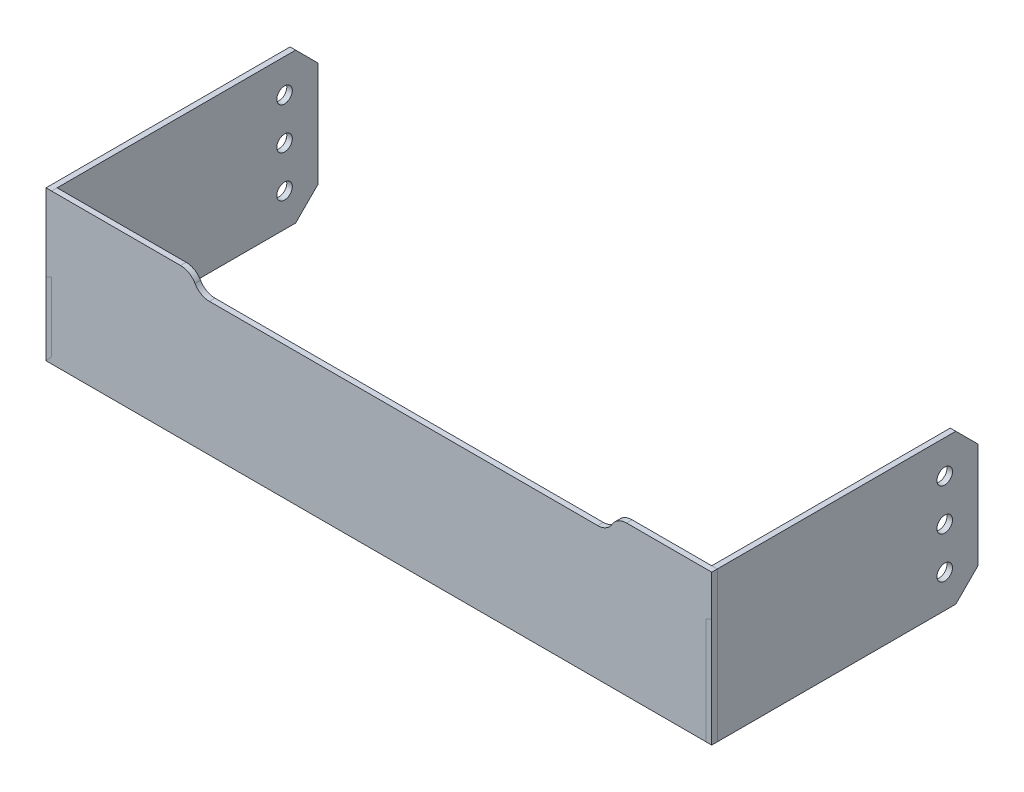
ISO-10303-21;
HEADER;
FILE_DESCRIPTION(('STEP AP214'),'2;1');
FILE_NAME('part.step','',(''),(''),'','','');
FILE_SCHEMA(('AUTOMOTIVE_DESIGN { 1 0 10303 214 1 1 1 1 }'));
ENDSEC;
DATA;
#1=APPLICATION_CONTEXT('core data for automotive mechanical design processes');
#2=APPLICATION_PROTOCOL_DEFINITION('international standard','automotive_design',2000,#1);
#3=PRODUCT_CONTEXT('',#1,'mechanical');
#4=PRODUCT('Part','Part','',(#3));
#5=PRODUCT_RELATED_PRODUCT_CATEGORY('part','',(#4));
#6=PRODUCT_DEFINITION_FORMATION('','',#4);
#7=PRODUCT_DEFINITION_CONTEXT('part definition',#1,'design');
#8=PRODUCT_DEFINITION('design','',#6,#7);
#9=PRODUCT_DEFINITION_SHAPE('','',#8);
#10=(LENGTH_UNIT() NAMED_UNIT(*) SI_UNIT(.MILLI.,.METRE.));
#11=(NAMED_UNIT(*) PLANE_ANGLE_UNIT() SI_UNIT($,.RADIAN.));
#12=(NAMED_UNIT(*) SI_UNIT($,.STERADIAN.) SOLID_ANGLE_UNIT());
#13=UNCERTAINTY_MEASURE_WITH_UNIT(LENGTH_MEASURE(1.E-05),#10,'distance_accuracy_value','');
#14=(GEOMETRIC_REPRESENTATION_CONTEXT(3) GLOBAL_UNCERTAINTY_ASSIGNED_CONTEXT((#13)) GLOBAL_UNIT_ASSIGNED_CONTEXT((#10,
#11,#12)) REPRESENTATION_CONTEXT('',''));
#15=CARTESIAN_POINT('',(0.,0.,0.));
#16=DIRECTION('',(0.,0.,1.));
#17=DIRECTION('',(1.,0.,0.));
#18=AXIS2_PLACEMENT_3D('',#15,#16,#17);
#19=CARTESIAN_POINT('',(-52.2463186573186,21.5222448416486,1.));
#20=DIRECTION('',(0.,0.,1.));
#21=DIRECTION('',(1.,0.,0.));
#22=AXIS2_PLACEMENT_3D('',#19,#20,#21);
#23=PLANE('',#22);
#24=DIRECTION('',(0.,1.,0.));
#25=VECTOR('',#24,1.);
#26=CARTESIAN_POINT('',(-53.2463186573186,21.5222448416486,1.));
#27=LINE('',#26,#25);
#28=CARTESIAN_POINT('',(-53.2463186573186,-5.47775515835141,1.));
#29=VERTEX_POINT('',#28);
#30=CARTESIAN_POINT('',(-53.2463186573186,21.5222448416486,1.));
#31=VERTEX_POINT('',#30);
#32=EDGE_CURVE('E141',#29,#31,#27,.T.);
#33=ORIENTED_EDGE('',*,*,#32,.F.);
#34=DIRECTION('',(-1.,0.,0.));
#35=VECTOR('',#34,1.);
#36=CARTESIAN_POINT('',(-52.2463186573186,-5.47775515835141,1.));
#37=LINE('',#36,#35);
#38=CARTESIAN_POINT('',(-52.2463186573186,-5.47775515835141,1.));
#39=VERTEX_POINT('',#38);
#40=EDGE_CURVE('E120',#39,#29,#37,.T.);
#41=ORIENTED_EDGE('',*,*,#40,.F.);
#42=DIRECTION('',(0.,1.,0.));
#43=VECTOR('',#42,1.);
#44=CARTESIAN_POINT('',(-52.2463186573186,21.5222448416486,1.));
#45=LINE('',#44,#43);
#46=CARTESIAN_POINT('',(-52.2463186573186,21.5222448416486,1.));
#47=VERTEX_POINT('',#46);
#48=EDGE_CURVE('E125',#39,#47,#45,.T.);
#49=ORIENTED_EDGE('',*,*,#48,.T.);
#50=DIRECTION('',(-1.,0.,0.));
#51=VECTOR('',#50,1.);
#52=CARTESIAN_POINT('',(-52.2463186573186,21.5222448416486,1.));
#53=LINE('',#52,#51);
#54=EDGE_CURVE('E110',#47,#31,#53,.T.);
#55=ORIENTED_EDGE('',*,*,#54,.T.);
#56=EDGE_LOOP('',(#33,#41,#49,#55));
#57=FACE_BOUND('',#56,.T.);
#58=ADVANCED_FACE('F54',(#57),#23,.T.);
#59=CARTESIAN_POINT('',(-52.2463186573186,-5.47775515835141,1.));
#60=DIRECTION('',(0.,-1.,0.));
#61=DIRECTION('',(0.,0.,-1.));
#62=AXIS2_PLACEMENT_3D('',#59,#60,#61);
#63=PLANE('',#62);
#64=DIRECTION('',(0.,0.,1.));
#65=VECTOR('',#64,1.);
#66=CARTESIAN_POINT('',(-53.2463186573186,-5.47775515835141,1.));
#67=LINE('',#66,#65);
#68=CARTESIAN_POINT('',(-53.2463186573186,-5.47775515835141,-43.));
#69=VERTEX_POINT('',#68);
#70=EDGE_CURVE('E130',#69,#29,#67,.T.);
#71=ORIENTED_EDGE('',*,*,#70,.F.);
#72=DIRECTION('',(1.,0.,0.));
#73=VECTOR('',#72,1.);
#74=CARTESIAN_POINT('',(-52.2463186573186,-5.47775515835141,-43.));
#75=LINE('',#74,#73);
#76=CARTESIAN_POINT('',(-52.2463186573186,-5.47775515835141,-43.));
#77=VERTEX_POINT('',#76);
#78=EDGE_CURVE('E78',#69,#77,#75,.T.);
#79=ORIENTED_EDGE('',*,*,#78,.T.);
#80=DIRECTION('',(0.,0.,1.));
#81=VECTOR('',#80,1.);
#82=CARTESIAN_POINT('',(-52.2463186573186,-5.47775515835141,1.));
#83=LINE('',#82,#81);
#84=EDGE_CURVE('E121',#77,#39,#83,.T.);
#85=ORIENTED_EDGE('',*,*,#84,.T.);
#86=ORIENTED_EDGE('',*,*,#40,.T.);
#87=EDGE_LOOP('',(#71,#79,#85,#86));
#88=FACE_BOUND('',#87,.T.);
#89=ADVANCED_FACE('F167',(#88),#63,.T.);
#90=CARTESIAN_POINT('',(-52.2463186573186,21.5222448416486,-47.));
#91=DIRECTION('',(0.,0.,-1.));
#92=DIRECTION('',(-1.,0.,0.));
#93=AXIS2_PLACEMENT_3D('',#90,#91,#92);
#94=PLANE('',#93);
#95=DIRECTION('',(0.,-1.,0.));
#96=VECTOR('',#95,1.);
#97=CARTESIAN_POINT('',(-52.2463186573186,21.5222448416486,-47.));
#98=LINE('',#97,#96);
#99=CARTESIAN_POINT('',(-52.2463186573186,17.5222448416486,-47.));
#100=VERTEX_POINT('',#99);
#101=CARTESIAN_POINT('',(-52.2463186573186,-1.4777551583514,-47.));
#102=VERTEX_POINT('',#101);
#103=EDGE_CURVE('E126',#100,#102,#98,.T.);
#104=ORIENTED_EDGE('',*,*,#103,.T.);
#105=DIRECTION('',(-1.,0.,0.));
#106=VECTOR('',#105,1.);
#107=CARTESIAN_POINT('',(-52.2463186573186,-1.4777551583514,-47.));
#108=LINE('',#107,#106);
#109=CARTESIAN_POINT('',(-53.2463186573186,-1.4777551583514,-47.));
#110=VERTEX_POINT('',#109);
#111=EDGE_CURVE('E149',#102,#110,#108,.T.);
#112=ORIENTED_EDGE('',*,*,#111,.T.);
#113=DIRECTION('',(0.,-1.,0.));
#114=VECTOR('',#113,1.);
#115=CARTESIAN_POINT('',(-53.2463186573186,21.5222448416486,-47.));
#116=LINE('',#115,#114);
#117=CARTESIAN_POINT('',(-53.2463186573186,17.5222448416486,-47.));
#118=VERTEX_POINT('',#117);
#119=EDGE_CURVE('E132',#118,#110,#116,.T.);
#120=ORIENTED_EDGE('',*,*,#119,.F.);
#121=DIRECTION('',(1.,0.,0.));
#122=VECTOR('',#121,1.);
#123=CARTESIAN_POINT('',(-52.2463186573186,17.5222448416486,-47.));
#124=LINE('',#123,#122);
#125=EDGE_CURVE('E146',#118,#100,#124,.T.);
#126=ORIENTED_EDGE('',*,*,#125,.T.);
#127=EDGE_LOOP('',(#104,#112,#120,#126));
#128=FACE_BOUND('',#127,.T.);
#129=ADVANCED_FACE('F161',(#128),#94,.T.);
#130=CARTESIAN_POINT('',(-52.2463186573186,21.5222448416486,1.));
#131=DIRECTION('',(0.,1.,0.));
#132=DIRECTION('',(0.,0.,1.));
#133=AXIS2_PLACEMENT_3D('',#130,#131,#132);
#134=PLANE('',#133);
#135=DIRECTION('',(0.,0.,-1.));
#136=VECTOR('',#135,1.);
#137=CARTESIAN_POINT('',(-52.2463186573186,21.5222448416486,1.));
#138=LINE('',#137,#136);
#139=CARTESIAN_POINT('',(-52.2463186573186,21.5222448416486,-43.));
#140=VERTEX_POINT('',#139);
#141=EDGE_CURVE('E112',#47,#140,#138,.T.);
#142=ORIENTED_EDGE('',*,*,#141,.T.);
#143=DIRECTION('',(-1.,0.,0.));
#144=VECTOR('',#143,1.);
#145=CARTESIAN_POINT('',(-52.2463186573186,21.5222448416486,-43.));
#146=LINE('',#145,#144);
#147=CARTESIAN_POINT('',(-53.2463186573186,21.5222448416486,-43.));
#148=VERTEX_POINT('',#147);
#149=EDGE_CURVE('E12',#140,#148,#146,.T.);
#150=ORIENTED_EDGE('',*,*,#149,.T.);
#151=DIRECTION('',(0.,0.,-1.));
#152=VECTOR('',#151,1.);
#153=CARTESIAN_POINT('',(-53.2463186573186,21.5222448416486,1.));
#154=LINE('',#153,#152);
#155=EDGE_CURVE('E115',#31,#148,#154,.T.);
#156=ORIENTED_EDGE('',*,*,#155,.F.);
#157=ORIENTED_EDGE('',*,*,#54,.F.);
#158=EDGE_LOOP('',(#142,#150,#156,#157));
#159=FACE_BOUND('',#158,.T.);
#160=ADVANCED_FACE('F111',(#159),#134,.T.);
#161=CARTESIAN_POINT('',(-52.2463186573186,0.,0.));
#162=DIRECTION('',(1.,0.,0.));
#163=DIRECTION('',(0.,0.,-1.));
#164=AXIS2_PLACEMENT_3D('',#161,#162,#163);
#165=PLANE('',#164);
#166=CARTESIAN_POINT('',(-52.2463186573186,15.5222448416486,-41.));
#167=DIRECTION('',(1.,0.,0.));
#168=DIRECTION('',(0.,0.,-1.));
#169=AXIS2_PLACEMENT_3D('',#166,#167,#168);
#170=CIRCLE('',#169,1.4);
#171=CARTESIAN_POINT('',(-52.2463186573186,15.5222448416486,-42.4));
#172=VERTEX_POINT('',#171);
#173=EDGE_CURVE('E135',#172,#172,#170,.T.);
#174=ORIENTED_EDGE('',*,*,#173,.F.);
#175=EDGE_LOOP('',(#174));
#176=FACE_BOUND('',#175,.T.);
#177=CARTESIAN_POINT('',(-52.2463186573186,8.02224484164859,-41.));
#178=DIRECTION('',(1.,0.,0.));
#179=DIRECTION('',(0.,0.,-1.));
#180=AXIS2_PLACEMENT_3D('',#177,#178,#179);
#181=CIRCLE('',#180,1.4);
#182=CARTESIAN_POINT('',(-52.2463186573186,8.02224484164859,-42.4));
#183=VERTEX_POINT('',#182);
#184=EDGE_CURVE('E218',#183,#183,#181,.T.);
#185=ORIENTED_EDGE('',*,*,#184,.F.);
#186=EDGE_LOOP('',(#185));
#187=FACE_BOUND('',#186,.T.);
#188=CARTESIAN_POINT('',(-52.2463186573186,0.522244841648586,-41.));
#189=DIRECTION('',(1.,0.,0.));
#190=DIRECTION('',(0.,0.,-1.));
#191=AXIS2_PLACEMENT_3D('',#188,#189,#190);
#192=CIRCLE('',#191,1.4);
#193=CARTESIAN_POINT('',(-52.2463186573186,0.522244841648586,-42.4));
#194=VERTEX_POINT('',#193);
#195=EDGE_CURVE('E214',#194,#194,#192,.T.);
#196=ORIENTED_EDGE('',*,*,#195,.F.);
#197=EDGE_LOOP('',(#196));
#198=FACE_BOUND('',#197,.T.);
#199=ORIENTED_EDGE('',*,*,#84,.F.);
#200=DIRECTION('',(0.,-0.707106781186546,0.707106781186549));
#201=VECTOR('',#200,1.);
#202=CARTESIAN_POINT('',(-52.2463186573186,-24.2388775791757,-24.2388775791756));
#203=LINE('',#202,#201);
#204=EDGE_CURVE('E63',#77,#102,#203,.F.);
#205=ORIENTED_EDGE('',*,*,#204,.T.);
#206=ORIENTED_EDGE('',*,*,#103,.F.);
#207=DIRECTION('',(0.,-0.707106781186548,-0.707106781186547));
#208=VECTOR('',#207,1.);
#209=CARTESIAN_POINT('',(-52.2463186573186,32.2611224208243,-32.2611224208243));
#210=LINE('',#209,#208);
#211=EDGE_CURVE('E70',#100,#140,#210,.F.);
#212=ORIENTED_EDGE('',*,*,#211,.T.);
#213=ORIENTED_EDGE('',*,*,#141,.F.);
#214=ORIENTED_EDGE('',*,*,#48,.F.);
#215=EDGE_LOOP('',(#199,#205,#206,#212,#213,#214));
#216=FACE_BOUND('',#215,.T.);
#217=ADVANCED_FACE('F124',(#176,#187,#198,#216),#165,.T.);
#218=CARTESIAN_POINT('',(-53.2463186573186,0.,0.));
#219=DIRECTION('',(1.,0.,0.));
#220=DIRECTION('',(0.,0.,-1.));
#221=AXIS2_PLACEMENT_3D('',#218,#219,#220);
#222=PLANE('',#221);
#223=CARTESIAN_POINT('',(-53.2463186573186,15.5222448416486,-41.));
#224=DIRECTION('',(-1.,0.,0.));
#225=DIRECTION('',(0.,0.,1.));
#226=AXIS2_PLACEMENT_3D('',#223,#224,#225);
#227=CIRCLE('',#226,1.4);
#228=CARTESIAN_POINT('',(-53.2463186573186,15.5222448416486,-39.6));
#229=VERTEX_POINT('',#228);
#230=EDGE_CURVE('E213',#229,#229,#227,.T.);
#231=ORIENTED_EDGE('',*,*,#230,.F.);
#232=EDGE_LOOP('',(#231));
#233=FACE_BOUND('',#232,.T.);
#234=CARTESIAN_POINT('',(-53.2463186573186,8.02224484164859,-41.));
#235=DIRECTION('',(-1.,0.,0.));
#236=DIRECTION('',(0.,0.,1.));
#237=AXIS2_PLACEMENT_3D('',#234,#235,#236);
#238=CIRCLE('',#237,1.4);
#239=CARTESIAN_POINT('',(-53.2463186573186,8.02224484164859,-39.6));
#240=VERTEX_POINT('',#239);
#241=EDGE_CURVE('E215',#240,#240,#238,.T.);
#242=ORIENTED_EDGE('',*,*,#241,.F.);
#243=EDGE_LOOP('',(#242));
#244=FACE_BOUND('',#243,.T.);
#245=CARTESIAN_POINT('',(-53.2463186573186,0.522244841648586,-41.));
#246=DIRECTION('',(-1.,0.,0.));
#247=DIRECTION('',(0.,0.,1.));
#248=AXIS2_PLACEMENT_3D('',#245,#246,#247);
#249=CIRCLE('',#248,1.4);
#250=CARTESIAN_POINT('',(-53.2463186573186,0.522244841648586,-39.6));
#251=VERTEX_POINT('',#250);
#252=EDGE_CURVE('E221',#251,#251,#249,.T.);
#253=ORIENTED_EDGE('',*,*,#252,.F.);
#254=EDGE_LOOP('',(#253));
#255=FACE_BOUND('',#254,.T.);
#256=ORIENTED_EDGE('',*,*,#119,.T.);
#257=DIRECTION('',(0.,0.707106781186546,-0.707106781186549));
#258=VECTOR('',#257,1.);
#259=CARTESIAN_POINT('',(-53.2463186573186,-1.4777551583514,-47.));
#260=LINE('',#259,#258);
#261=EDGE_CURVE('E154',#110,#69,#260,.F.);
#262=ORIENTED_EDGE('',*,*,#261,.T.);
#263=ORIENTED_EDGE('',*,*,#70,.T.);
#264=ORIENTED_EDGE('',*,*,#32,.T.);
#265=ORIENTED_EDGE('',*,*,#155,.T.);
#266=DIRECTION('',(0.,0.707106781186548,0.707106781186547));
#267=VECTOR('',#266,1.);
#268=CARTESIAN_POINT('',(-53.2463186573186,21.5222448416486,-43.));
#269=LINE('',#268,#267);
#270=EDGE_CURVE('E152',#148,#118,#269,.F.);
#271=ORIENTED_EDGE('',*,*,#270,.T.);
#272=EDGE_LOOP('',(#256,#262,#263,#264,#265,#271));
#273=FACE_BOUND('',#272,.T.);
#274=ADVANCED_FACE('F166',(#233,#244,#255,#273),#222,.F.);
#275=CARTESIAN_POINT('',(-52.2463186573186,-1.4777551583514,-47.));
#276=DIRECTION('',(0.,0.707106781186549,0.707106781186546));
#277=DIRECTION('',(-1.,0.,0.));
#278=AXIS2_PLACEMENT_3D('',#275,#276,#277);
#279=PLANE('',#278);
#280=ORIENTED_EDGE('',*,*,#204,.F.);
#281=ORIENTED_EDGE('',*,*,#78,.F.);
#282=ORIENTED_EDGE('',*,*,#261,.F.);
#283=ORIENTED_EDGE('',*,*,#111,.F.);
#284=EDGE_LOOP('',(#280,#281,#282,#283));
#285=FACE_BOUND('',#284,.T.);
#286=ADVANCED_FACE('F164',(#285),#279,.F.);
#287=CARTESIAN_POINT('',(-52.2463186573186,21.5222448416486,-43.));
#288=DIRECTION('',(0.,-0.707106781186547,0.707106781186548));
#289=DIRECTION('',(-1.,0.,0.));
#290=AXIS2_PLACEMENT_3D('',#287,#288,#289);
#291=PLANE('',#290);
#292=ORIENTED_EDGE('',*,*,#211,.F.);
#293=ORIENTED_EDGE('',*,*,#125,.F.);
#294=ORIENTED_EDGE('',*,*,#270,.F.);
#295=ORIENTED_EDGE('',*,*,#149,.F.);
#296=EDGE_LOOP('',(#292,#293,#294,#295));
#297=FACE_BOUND('',#296,.T.);
#298=ADVANCED_FACE('F57',(#297),#291,.F.);
#299=CARTESIAN_POINT('',(66.7536813426814,0.522244841648586,-41.));
#300=DIRECTION('',(-1.,0.,0.));
#301=DIRECTION('',(0.,0.,1.));
#302=AXIS2_PLACEMENT_3D('',#299,#300,#301);
#303=CYLINDRICAL_SURFACE('',#302,1.4);
#304=ORIENTED_EDGE('',*,*,#195,.T.);
#305=EDGE_LOOP('',(#304));
#306=FACE_BOUND('',#305,.T.);
#307=ORIENTED_EDGE('',*,*,#252,.T.);
#308=EDGE_LOOP('',(#307));
#309=FACE_BOUND('',#308,.T.);
#310=ADVANCED_FACE('F170',(#306,#309),#303,.F.);
#311=CARTESIAN_POINT('',(66.7536813426814,8.02224484164859,-41.));
#312=DIRECTION('',(-1.,0.,0.));
#313=DIRECTION('',(0.,0.,1.));
#314=AXIS2_PLACEMENT_3D('',#311,#312,#313);
#315=CYLINDRICAL_SURFACE('',#314,1.4);
#316=ORIENTED_EDGE('',*,*,#184,.T.);
#317=EDGE_LOOP('',(#316));
#318=FACE_BOUND('',#317,.T.);
#319=ORIENTED_EDGE('',*,*,#241,.T.);
#320=EDGE_LOOP('',(#319));
#321=FACE_BOUND('',#320,.T.);
#322=ADVANCED_FACE('F175',(#318,#321),#315,.F.);
#323=CARTESIAN_POINT('',(66.7536813426814,15.5222448416486,-41.));
#324=DIRECTION('',(-1.,0.,0.));
#325=DIRECTION('',(0.,0.,1.));
#326=AXIS2_PLACEMENT_3D('',#323,#324,#325);
#327=CYLINDRICAL_SURFACE('',#326,1.4);
#328=ORIENTED_EDGE('',*,*,#173,.T.);
#329=EDGE_LOOP('',(#328));
#330=FACE_BOUND('',#329,.T.);
#331=ORIENTED_EDGE('',*,*,#230,.T.);
#332=EDGE_LOOP('',(#331));
#333=FACE_BOUND('',#332,.T.);
#334=ADVANCED_FACE('F202',(#330,#333),#327,.F.);
#335=CLOSED_SHELL('',(#58,#89,#129,#160,#217,#274,#286,#298,#310,#322,#334));
#336=MANIFOLD_SOLID_BREP('B2',#335);
#337=CARTESIAN_POINT('',(65.7536813426814,21.5222448416486,1.));
#338=DIRECTION('',(0.,0.,1.));
#339=DIRECTION('',(0.,-1.,0.));
#340=AXIS2_PLACEMENT_3D('',#337,#338,#339);
#341=PLANE('',#340);
#342=DIRECTION('',(0.,-1.,0.));
#343=VECTOR('',#342,1.);
#344=CARTESIAN_POINT('',(66.7536813426814,21.5222448416486,1.));
#345=LINE('',#344,#343);
#346=CARTESIAN_POINT('',(66.7536813426814,21.5222448416486,1.));
#347=VERTEX_POINT('',#346);
#348=CARTESIAN_POINT('',(66.7536813426814,-5.47775515835141,0.999999999999997));
#349=VERTEX_POINT('',#348);
#350=EDGE_CURVE('E429',#347,#349,#345,.T.);
#351=ORIENTED_EDGE('',*,*,#350,.F.);
#352=DIRECTION('',(1.,0.,0.));
#353=VECTOR('',#352,1.);
#354=CARTESIAN_POINT('',(65.7536813426814,21.5222448416486,1.));
#355=LINE('',#354,#353);
#356=CARTESIAN_POINT('',(65.7536813426814,21.5222448416486,1.));
#357=VERTEX_POINT('',#356);
#358=EDGE_CURVE('E408',#357,#347,#355,.T.);
#359=ORIENTED_EDGE('',*,*,#358,.F.);
#360=DIRECTION('',(0.,-1.,0.));
#361=VECTOR('',#360,1.);
#362=CARTESIAN_POINT('',(65.7536813426814,21.5222448416486,1.));
#363=LINE('',#362,#361);
#364=CARTESIAN_POINT('',(65.7536813426814,-5.47775515835141,0.999999999999997));
#365=VERTEX_POINT('',#364);
#366=EDGE_CURVE('E413',#357,#365,#363,.T.);
#367=ORIENTED_EDGE('',*,*,#366,.T.);
#368=DIRECTION('',(1.,0.,0.));
#369=VECTOR('',#368,1.);
#370=CARTESIAN_POINT('',(65.7536813426814,-5.47775515835141,0.999999999999997));
#371=LINE('',#370,#369);
#372=EDGE_CURVE('E396',#365,#349,#371,.T.);
#373=ORIENTED_EDGE('',*,*,#372,.T.);
#374=EDGE_LOOP('',(#351,#359,#367,#373));
#375=FACE_BOUND('',#374,.T.);
#376=ADVANCED_FACE('F342',(#375),#341,.T.);
#377=CARTESIAN_POINT('',(65.7536813426814,21.5222448416486,1.));
#378=DIRECTION('',(0.,1.,0.));
#379=DIRECTION('',(0.,0.,1.));
#380=AXIS2_PLACEMENT_3D('',#377,#378,#379);
#381=PLANE('',#380);
#382=DIRECTION('',(0.,0.,1.));
#383=VECTOR('',#382,1.);
#384=CARTESIAN_POINT('',(66.7536813426814,21.5222448416486,1.));
#385=LINE('',#384,#383);
#386=CARTESIAN_POINT('',(66.7536813426814,21.5222448416486,-43.));
#387=VERTEX_POINT('',#386);
#388=EDGE_CURVE('E419',#387,#347,#385,.T.);
#389=ORIENTED_EDGE('',*,*,#388,.F.);
#390=DIRECTION('',(-1.,0.,0.));
#391=VECTOR('',#390,1.);
#392=CARTESIAN_POINT('',(65.7536813426814,21.5222448416486,-43.));
#393=LINE('',#392,#391);
#394=CARTESIAN_POINT('',(65.7536813426814,21.5222448416486,-43.));
#395=VERTEX_POINT('',#394);
#396=EDGE_CURVE('E52',#387,#395,#393,.T.);
#397=ORIENTED_EDGE('',*,*,#396,.T.);
#398=DIRECTION('',(0.,0.,1.));
#399=VECTOR('',#398,1.);
#400=CARTESIAN_POINT('',(65.7536813426814,21.5222448416486,1.));
#401=LINE('',#400,#399);
#402=EDGE_CURVE('E409',#395,#357,#401,.T.);
#403=ORIENTED_EDGE('',*,*,#402,.T.);
#404=ORIENTED_EDGE('',*,*,#358,.T.);
#405=EDGE_LOOP('',(#389,#397,#403,#404));
#406=FACE_BOUND('',#405,.T.);
#407=ADVANCED_FACE('F455',(#406),#381,.T.);
#408=CARTESIAN_POINT('',(65.7536813426814,21.5222448416486,-47.));
#409=DIRECTION('',(0.,0.,-1.));
#410=DIRECTION('',(-1.,0.,0.));
#411=AXIS2_PLACEMENT_3D('',#408,#409,#410);
#412=PLANE('',#411);
#413=DIRECTION('',(0.,1.,0.));
#414=VECTOR('',#413,1.);
#415=CARTESIAN_POINT('',(66.7536813426814,21.5222448416486,-47.));
#416=LINE('',#415,#414);
#417=CARTESIAN_POINT('',(66.7536813426814,-1.47775515835139,-47.));
#418=VERTEX_POINT('',#417);
#419=CARTESIAN_POINT('',(66.7536813426814,17.5222448416486,-47.));
#420=VERTEX_POINT('',#419);
#421=EDGE_CURVE('E421',#418,#420,#416,.T.);
#422=ORIENTED_EDGE('',*,*,#421,.F.);
#423=DIRECTION('',(-1.,0.,0.));
#424=VECTOR('',#423,1.);
#425=CARTESIAN_POINT('',(65.7536813426814,-1.47775515835139,-47.));
#426=LINE('',#425,#424);
#427=CARTESIAN_POINT('',(65.7536813426814,-1.47775515835139,-47.));
#428=VERTEX_POINT('',#427);
#429=EDGE_CURVE('E444',#418,#428,#426,.T.);
#430=ORIENTED_EDGE('',*,*,#429,.T.);
#431=DIRECTION('',(0.,1.,0.));
#432=VECTOR('',#431,1.);
#433=CARTESIAN_POINT('',(65.7536813426814,21.5222448416486,-47.));
#434=LINE('',#433,#432);
#435=CARTESIAN_POINT('',(65.7536813426814,17.5222448416486,-47.));
#436=VERTEX_POINT('',#435);
#437=EDGE_CURVE('E415',#428,#436,#434,.T.);
#438=ORIENTED_EDGE('',*,*,#437,.T.);
#439=DIRECTION('',(1.,0.,0.));
#440=VECTOR('',#439,1.);
#441=CARTESIAN_POINT('',(65.7536813426814,17.5222448416486,-47.));
#442=LINE('',#441,#440);
#443=EDGE_CURVE('E441',#436,#420,#442,.T.);
#444=ORIENTED_EDGE('',*,*,#443,.T.);
#445=EDGE_LOOP('',(#422,#430,#438,#444));
#446=FACE_BOUND('',#445,.T.);
#447=ADVANCED_FACE('F449',(#446),#412,.T.);
#448=CARTESIAN_POINT('',(65.7536813426814,-5.47775515835141,0.999999999999997));
#449=DIRECTION('',(0.,-1.,0.));
#450=DIRECTION('',(0.,0.,-1.));
#451=AXIS2_PLACEMENT_3D('',#448,#449,#450);
#452=PLANE('',#451);
#453=DIRECTION('',(0.,0.,-1.));
#454=VECTOR('',#453,1.);
#455=CARTESIAN_POINT('',(65.7536813426814,-5.47775515835141,0.999999999999997));
#456=LINE('',#455,#454);
#457=CARTESIAN_POINT('',(65.7536813426814,-5.47775515835141,-43.));
#458=VERTEX_POINT('',#457);
#459=EDGE_CURVE('E400',#365,#458,#456,.T.);
#460=ORIENTED_EDGE('',*,*,#459,.T.);
#461=DIRECTION('',(1.,0.,0.));
#462=VECTOR('',#461,1.);
#463=CARTESIAN_POINT('',(65.7536813426814,-5.47775515835141,-43.));
#464=LINE('',#463,#462);
#465=CARTESIAN_POINT('',(66.7536813426814,-5.47775515835141,-43.));
#466=VERTEX_POINT('',#465);
#467=EDGE_CURVE('E434',#458,#466,#464,.T.);
#468=ORIENTED_EDGE('',*,*,#467,.T.);
#469=DIRECTION('',(0.,0.,-1.));
#470=VECTOR('',#469,1.);
#471=CARTESIAN_POINT('',(66.7536813426814,-5.47775515835141,0.999999999999997));
#472=LINE('',#471,#470);
#473=EDGE_CURVE('E403',#349,#466,#472,.T.);
#474=ORIENTED_EDGE('',*,*,#473,.F.);
#475=ORIENTED_EDGE('',*,*,#372,.F.);
#476=EDGE_LOOP('',(#460,#468,#474,#475));
#477=FACE_BOUND('',#476,.T.);
#478=ADVANCED_FACE('F398',(#477),#452,.T.);
#479=CARTESIAN_POINT('',(65.7536813426814,0.,0.));
#480=DIRECTION('',(1.,0.,0.));
#481=DIRECTION('',(0.,0.,-1.));
#482=AXIS2_PLACEMENT_3D('',#479,#480,#481);
#483=PLANE('',#482);
#484=CARTESIAN_POINT('',(65.7536813426814,15.5222448416486,-41.));
#485=DIRECTION('',(1.,0.,0.));
#486=DIRECTION('',(0.,0.,-1.));
#487=AXIS2_PLACEMENT_3D('',#484,#485,#486);
#488=CIRCLE('',#487,1.4);
#489=CARTESIAN_POINT('',(65.7536813426814,15.5222448416486,-42.4));
#490=VERTEX_POINT('',#489);
#491=EDGE_CURVE('E424',#490,#490,#488,.T.);
#492=ORIENTED_EDGE('',*,*,#491,.T.);
#493=EDGE_LOOP('',(#492));
#494=FACE_BOUND('',#493,.T.);
#495=CARTESIAN_POINT('',(65.7536813426814,8.02224484164859,-41.));
#496=DIRECTION('',(1.,0.,0.));
#497=DIRECTION('',(0.,0.,-1.));
#498=AXIS2_PLACEMENT_3D('',#495,#496,#497);
#499=CIRCLE('',#498,1.4);
#500=CARTESIAN_POINT('',(65.7536813426814,8.02224484164859,-42.4));
#501=VERTEX_POINT('',#500);
#502=EDGE_CURVE('E502',#501,#501,#499,.T.);
#503=ORIENTED_EDGE('',*,*,#502,.T.);
#504=EDGE_LOOP('',(#503));
#505=FACE_BOUND('',#504,.T.);
#506=CARTESIAN_POINT('',(65.7536813426814,0.522244841648586,-41.));
#507=DIRECTION('',(1.,0.,0.));
#508=DIRECTION('',(0.,0.,-1.));
#509=AXIS2_PLACEMENT_3D('',#506,#507,#508);
#510=CIRCLE('',#509,1.4);
#511=CARTESIAN_POINT('',(65.7536813426814,0.522244841648586,-42.4));
#512=VERTEX_POINT('',#511);
#513=EDGE_CURVE('E504',#512,#512,#510,.T.);
#514=ORIENTED_EDGE('',*,*,#513,.T.);
#515=EDGE_LOOP('',(#514));
#516=FACE_BOUND('',#515,.T.);
#517=ORIENTED_EDGE('',*,*,#437,.F.);
#518=DIRECTION('',(0.,0.707106781186549,-0.707106781186546));
#519=VECTOR('',#518,1.);
#520=CARTESIAN_POINT('',(65.7536813426814,-5.47775515835141,-43.));
#521=LINE('',#520,#519);
#522=EDGE_CURVE('E351',#428,#458,#521,.F.);
#523=ORIENTED_EDGE('',*,*,#522,.T.);
#524=ORIENTED_EDGE('',*,*,#459,.F.);
#525=ORIENTED_EDGE('',*,*,#366,.F.);
#526=ORIENTED_EDGE('',*,*,#402,.F.);
#527=DIRECTION('',(0.,0.707106781186546,0.707106781186549));
#528=VECTOR('',#527,1.);
#529=CARTESIAN_POINT('',(65.7536813426814,17.5222448416486,-47.));
#530=LINE('',#529,#528);
#531=EDGE_CURVE('E363',#395,#436,#530,.F.);
#532=ORIENTED_EDGE('',*,*,#531,.T.);
#533=EDGE_LOOP('',(#517,#523,#524,#525,#526,#532));
#534=FACE_BOUND('',#533,.T.);
#535=ADVANCED_FACE('F412',(#494,#505,#516,#534),#483,.F.);
#536=CARTESIAN_POINT('',(66.7536813426814,0.,0.));
#537=DIRECTION('',(1.,0.,0.));
#538=DIRECTION('',(0.,0.,-1.));
#539=AXIS2_PLACEMENT_3D('',#536,#537,#538);
#540=PLANE('',#539);
#541=CARTESIAN_POINT('',(66.7536813426814,15.5222448416486,-41.));
#542=DIRECTION('',(-1.,0.,0.));
#543=DIRECTION('',(0.,0.,1.));
#544=AXIS2_PLACEMENT_3D('',#541,#542,#543);
#545=CIRCLE('',#544,1.4);
#546=CARTESIAN_POINT('',(66.7536813426814,15.5222448416486,-39.6));
#547=VERTEX_POINT('',#546);
#548=EDGE_CURVE('E499',#547,#547,#545,.T.);
#549=ORIENTED_EDGE('',*,*,#548,.T.);
#550=EDGE_LOOP('',(#549));
#551=FACE_BOUND('',#550,.T.);
#552=CARTESIAN_POINT('',(66.7536813426814,8.02224484164859,-41.));
#553=DIRECTION('',(-1.,0.,0.));
#554=DIRECTION('',(0.,0.,1.));
#555=AXIS2_PLACEMENT_3D('',#552,#553,#554);
#556=CIRCLE('',#555,1.4);
#557=CARTESIAN_POINT('',(66.7536813426814,8.02224484164859,-39.6));
#558=VERTEX_POINT('',#557);
#559=EDGE_CURVE('E513',#558,#558,#556,.T.);
#560=ORIENTED_EDGE('',*,*,#559,.T.);
#561=EDGE_LOOP('',(#560));
#562=FACE_BOUND('',#561,.T.);
#563=CARTESIAN_POINT('',(66.7536813426814,0.522244841648586,-41.));
#564=DIRECTION('',(-1.,0.,0.));
#565=DIRECTION('',(0.,0.,1.));
#566=AXIS2_PLACEMENT_3D('',#563,#564,#565);
#567=CIRCLE('',#566,1.4);
#568=CARTESIAN_POINT('',(66.7536813426814,0.522244841648586,-39.6));
#569=VERTEX_POINT('',#568);
#570=EDGE_CURVE('E510',#569,#569,#567,.T.);
#571=ORIENTED_EDGE('',*,*,#570,.T.);
#572=EDGE_LOOP('',(#571));
#573=FACE_BOUND('',#572,.T.);
#574=ORIENTED_EDGE('',*,*,#473,.T.);
#575=DIRECTION('',(0.,-0.707106781186549,0.707106781186546));
#576=VECTOR('',#575,1.);
#577=CARTESIAN_POINT('',(66.7536813426814,-24.2388775791757,-24.2388775791758));
#578=LINE('',#577,#576);
#579=EDGE_CURVE('E439',#466,#418,#578,.F.);
#580=ORIENTED_EDGE('',*,*,#579,.T.);
#581=ORIENTED_EDGE('',*,*,#421,.T.);
#582=DIRECTION('',(0.,-0.707106781186546,-0.707106781186549));
#583=VECTOR('',#582,1.);
#584=CARTESIAN_POINT('',(66.7536813426814,32.2611224208243,-32.2611224208242));
#585=LINE('',#584,#583);
#586=EDGE_CURVE('E437',#420,#387,#585,.F.);
#587=ORIENTED_EDGE('',*,*,#586,.T.);
#588=ORIENTED_EDGE('',*,*,#388,.T.);
#589=ORIENTED_EDGE('',*,*,#350,.T.);
#590=EDGE_LOOP('',(#574,#580,#581,#587,#588,#589));
#591=FACE_BOUND('',#590,.T.);
#592=ADVANCED_FACE('F454',(#551,#562,#573,#591),#540,.T.);
#593=CARTESIAN_POINT('',(65.7536813426814,-5.47775515835141,-43.));
#594=DIRECTION('',(0.,0.707106781186546,0.707106781186549));
#595=DIRECTION('',(1.,0.,0.));
#596=AXIS2_PLACEMENT_3D('',#593,#594,#595);
#597=PLANE('',#596);
#598=ORIENTED_EDGE('',*,*,#522,.F.);
#599=ORIENTED_EDGE('',*,*,#429,.F.);
#600=ORIENTED_EDGE('',*,*,#579,.F.);
#601=ORIENTED_EDGE('',*,*,#467,.F.);
#602=EDGE_LOOP('',(#598,#599,#600,#601));
#603=FACE_BOUND('',#602,.T.);
#604=ADVANCED_FACE('F452',(#603),#597,.F.);
#605=CARTESIAN_POINT('',(65.7536813426814,17.5222448416486,-47.));
#606=DIRECTION('',(0.,-0.707106781186549,0.707106781186546));
#607=DIRECTION('',(1.,0.,0.));
#608=AXIS2_PLACEMENT_3D('',#605,#606,#607);
#609=PLANE('',#608);
#610=ORIENTED_EDGE('',*,*,#531,.F.);
#611=ORIENTED_EDGE('',*,*,#396,.F.);
#612=ORIENTED_EDGE('',*,*,#586,.F.);
#613=ORIENTED_EDGE('',*,*,#443,.F.);
#614=EDGE_LOOP('',(#610,#611,#612,#613));
#615=FACE_BOUND('',#614,.T.);
#616=ADVANCED_FACE('F345',(#615),#609,.F.);
#617=CARTESIAN_POINT('',(66.7536813426814,0.522244841648586,-41.));
#618=DIRECTION('',(-1.,0.,0.));
#619=DIRECTION('',(0.,0.,1.));
#620=AXIS2_PLACEMENT_3D('',#617,#618,#619);
#621=CYLINDRICAL_SURFACE('',#620,1.4);
#622=ORIENTED_EDGE('',*,*,#570,.F.);
#623=EDGE_LOOP('',(#622));
#624=FACE_BOUND('',#623,.T.);
#625=ORIENTED_EDGE('',*,*,#513,.F.);
#626=EDGE_LOOP('',(#625));
#627=FACE_BOUND('',#626,.T.);
#628=ADVANCED_FACE('F458',(#624,#627),#621,.F.);
#629=CARTESIAN_POINT('',(66.7536813426814,8.02224484164859,-41.));
#630=DIRECTION('',(-1.,0.,0.));
#631=DIRECTION('',(0.,0.,1.));
#632=AXIS2_PLACEMENT_3D('',#629,#630,#631);
#633=CYLINDRICAL_SURFACE('',#632,1.4);
#634=ORIENTED_EDGE('',*,*,#559,.F.);
#635=EDGE_LOOP('',(#634));
#636=FACE_BOUND('',#635,.T.);
#637=ORIENTED_EDGE('',*,*,#502,.F.);
#638=EDGE_LOOP('',(#637));
#639=FACE_BOUND('',#638,.T.);
#640=ADVANCED_FACE('F463',(#636,#639),#633,.F.);
#641=CARTESIAN_POINT('',(66.7536813426814,15.5222448416486,-41.));
#642=DIRECTION('',(-1.,0.,0.));
#643=DIRECTION('',(0.,0.,1.));
#644=AXIS2_PLACEMENT_3D('',#641,#642,#643);
#645=CYLINDRICAL_SURFACE('',#644,1.4);
#646=ORIENTED_EDGE('',*,*,#548,.F.);
#647=EDGE_LOOP('',(#646));
#648=FACE_BOUND('',#647,.T.);
#649=ORIENTED_EDGE('',*,*,#491,.F.);
#650=EDGE_LOOP('',(#649));
#651=FACE_BOUND('',#650,.T.);
#652=ADVANCED_FACE('F490',(#648,#651),#645,.F.);
#653=CLOSED_SHELL('',(#376,#407,#447,#478,#535,#592,#604,#616,#628,#640,#652));
#654=MANIFOLD_SOLID_BREP('B6',#653);
#655=CARTESIAN_POINT('',(-53.2463186573186,-5.47775515835141,1.));
#656=DIRECTION('',(1.,0.,0.));
#657=DIRECTION('',(0.,0.,-1.));
#658=AXIS2_PLACEMENT_3D('',#655,#656,#657);
#659=PLANE('',#658);
#660=DIRECTION('',(0.,-1.,0.));
#661=VECTOR('',#660,1.);
#662=CARTESIAN_POINT('',(-53.2463186573186,-5.47775515835141,0.));
#663=LINE('',#662,#661);
#664=CARTESIAN_POINT('',(-53.2463186573186,21.5222448416486,0.));
#665=VERTEX_POINT('',#664);
#666=CARTESIAN_POINT('',(-53.2463186573186,-5.47775515835141,0.));
#667=VERTEX_POINT('',#666);
#668=EDGE_CURVE('E720',#665,#667,#663,.T.);
#669=ORIENTED_EDGE('',*,*,#668,.T.);
#670=DIRECTION('',(0.,0.,-1.));
#671=VECTOR('',#670,1.);
#672=CARTESIAN_POINT('',(-53.2463186573186,-5.47775515835141,1.));
#673=LINE('',#672,#671);
#674=CARTESIAN_POINT('',(-53.2463186573186,-5.47775515835141,1.));
#675=VERTEX_POINT('',#674);
#676=EDGE_CURVE('E702',#675,#667,#673,.T.);
#677=ORIENTED_EDGE('',*,*,#676,.F.);
#678=DIRECTION('',(0.,-1.,0.));
#679=VECTOR('',#678,1.);
#680=CARTESIAN_POINT('',(-53.2463186573186,-5.47775515835141,1.));
#681=LINE('',#680,#679);
#682=CARTESIAN_POINT('',(-53.2463186573186,21.5222448416486,1.));
#683=VERTEX_POINT('',#682);
#684=EDGE_CURVE('E708',#683,#675,#681,.T.);
#685=ORIENTED_EDGE('',*,*,#684,.F.);
#686=DIRECTION('',(0.,0.,-1.));
#687=VECTOR('',#686,1.);
#688=CARTESIAN_POINT('',(-53.2463186573186,21.5222448416486,1.));
#689=LINE('',#688,#687);
#690=EDGE_CURVE('E766',#683,#665,#689,.T.);
#691=ORIENTED_EDGE('',*,*,#690,.T.);
#692=EDGE_LOOP('',(#669,#677,#685,#691));
#693=FACE_BOUND('',#692,.T.);
#694=ADVANCED_FACE('F621',(#693),#659,.F.);
#695=CARTESIAN_POINT('',(-53.2463186573186,-5.47775515835141,1.));
#696=DIRECTION('',(0.,1.,0.));
#697=DIRECTION('',(0.,0.,1.));
#698=AXIS2_PLACEMENT_3D('',#695,#696,#697);
#699=PLANE('',#698);
#700=DIRECTION('',(1.,0.,0.));
#701=VECTOR('',#700,1.);
#702=CARTESIAN_POINT('',(-53.2463186573186,-5.47775515835141,0.));
#703=LINE('',#702,#701);
#704=CARTESIAN_POINT('',(66.7536813426814,-5.47775515835141,0.));
#705=VERTEX_POINT('',#704);
#706=EDGE_CURVE('E779',#667,#705,#703,.T.);
#707=ORIENTED_EDGE('',*,*,#706,.T.);
#708=DIRECTION('',(0.,0.,-1.));
#709=VECTOR('',#708,1.);
#710=CARTESIAN_POINT('',(66.7536813426814,-5.47775515835141,1.));
#711=LINE('',#710,#709);
#712=CARTESIAN_POINT('',(66.7536813426814,-5.47775515835141,1.));
#713=VERTEX_POINT('',#712);
#714=EDGE_CURVE('E705',#713,#705,#711,.T.);
#715=ORIENTED_EDGE('',*,*,#714,.F.);
#716=DIRECTION('',(1.,0.,0.));
#717=VECTOR('',#716,1.);
#718=CARTESIAN_POINT('',(-53.2463186573186,-5.47775515835141,1.));
#719=LINE('',#718,#717);
#720=EDGE_CURVE('E698',#675,#713,#719,.T.);
#721=ORIENTED_EDGE('',*,*,#720,.F.);
#722=ORIENTED_EDGE('',*,*,#676,.T.);
#723=EDGE_LOOP('',(#707,#715,#721,#722));
#724=FACE_BOUND('',#723,.T.);
#725=ADVANCED_FACE('F700',(#724),#699,.F.);
#726=CARTESIAN_POINT('',(66.7536813426814,-5.47775515835141,1.));
#727=DIRECTION('',(-1.,0.,0.));
#728=DIRECTION('',(0.,0.,1.));
#729=AXIS2_PLACEMENT_3D('',#726,#727,#728);
#730=PLANE('',#729);
#731=DIRECTION('',(0.,1.,0.));
#732=VECTOR('',#731,1.);
#733=CARTESIAN_POINT('',(66.7536813426814,-5.47775515835141,0.));
#734=LINE('',#733,#732);
#735=CARTESIAN_POINT('',(66.7536813426814,21.5222448416486,0.));
#736=VERTEX_POINT('',#735);
#737=EDGE_CURVE('E778',#705,#736,#734,.T.);
#738=ORIENTED_EDGE('',*,*,#737,.T.);
#739=DIRECTION('',(0.,0.,-1.));
#740=VECTOR('',#739,1.);
#741=CARTESIAN_POINT('',(66.7536813426814,21.5222448416486,1.));
#742=LINE('',#741,#740);
#743=CARTESIAN_POINT('',(66.7536813426814,21.5222448416486,1.));
#744=VERTEX_POINT('',#743);
#745=EDGE_CURVE('E726',#744,#736,#742,.T.);
#746=ORIENTED_EDGE('',*,*,#745,.F.);
#747=DIRECTION('',(0.,1.,0.));
#748=VECTOR('',#747,1.);
#749=CARTESIAN_POINT('',(66.7536813426814,-5.47775515835141,1.));
#750=LINE('',#749,#748);
#751=EDGE_CURVE('E707',#713,#744,#750,.T.);
#752=ORIENTED_EDGE('',*,*,#751,.F.);
#753=ORIENTED_EDGE('',*,*,#714,.T.);
#754=EDGE_LOOP('',(#738,#746,#752,#753));
#755=FACE_BOUND('',#754,.T.);
#756=ADVANCED_FACE('F790',(#755),#730,.F.);
#757=CARTESIAN_POINT('',(49.2071183643734,21.5222448416486,1.));
#758=DIRECTION('',(0.,-1.,0.));
#759=DIRECTION('',(1.,0.,0.));
#760=AXIS2_PLACEMENT_3D('',#757,#758,#759);
#761=PLANE('',#760);
#762=DIRECTION('',(-1.,0.,0.));
#763=VECTOR('',#762,1.);
#764=CARTESIAN_POINT('',(49.2071183643734,21.5222448416486,0.));
#765=LINE('',#764,#763);
#766=CARTESIAN_POINT('',(51.40327078708,21.5222448416486,0.));
#767=VERTEX_POINT('',#766);
#768=EDGE_CURVE('E762',#736,#767,#765,.T.);
#769=ORIENTED_EDGE('',*,*,#768,.T.);
#770=DIRECTION('',(0.,0.,1.));
#771=VECTOR('',#770,1.);
#772=CARTESIAN_POINT('',(51.40327078708,21.5222448416486,1.));
#773=LINE('',#772,#771);
#774=CARTESIAN_POINT('',(51.40327078708,21.5222448416486,1.));
#775=VERTEX_POINT('',#774);
#776=EDGE_CURVE('E747',#767,#775,#773,.T.);
#777=ORIENTED_EDGE('',*,*,#776,.T.);
#778=DIRECTION('',(-1.,0.,0.));
#779=VECTOR('',#778,1.);
#780=CARTESIAN_POINT('',(49.2071183643734,21.5222448416486,1.));
#781=LINE('',#780,#779);
#782=EDGE_CURVE('E775',#744,#775,#781,.T.);
#783=ORIENTED_EDGE('',*,*,#782,.F.);
#784=ORIENTED_EDGE('',*,*,#745,.T.);
#785=EDGE_LOOP('',(#769,#777,#783,#784));
#786=FACE_BOUND('',#785,.T.);
#787=ADVANCED_FACE('F773',(#786),#761,.F.);
#788=CARTESIAN_POINT('',(-26.7928816356267,18.5222448416486,1.));
#789=DIRECTION('',(0.,-1.,0.));
#790=DIRECTION('',(0.,0.,-1.));
#791=AXIS2_PLACEMENT_3D('',#788,#789,#790);
#792=PLANE('',#791);
#793=DIRECTION('',(-1.,0.,0.));
#794=VECTOR('',#793,1.);
#795=CARTESIAN_POINT('',(-26.7928816356267,18.5222448416486,0.));
#796=LINE('',#795,#794);
#797=CARTESIAN_POINT('',(46.2071183643734,18.5222448416486,0.));
#798=VERTEX_POINT('',#797);
#799=CARTESIAN_POINT('',(-23.7928816356267,18.5222448416486,0.));
#800=VERTEX_POINT('',#799);
#801=EDGE_CURVE('E759',#798,#800,#796,.T.);
#802=ORIENTED_EDGE('',*,*,#801,.T.);
#803=DIRECTION('',(0.,0.,-1.));
#804=VECTOR('',#803,1.);
#805=CARTESIAN_POINT('',(-23.7928816356267,18.5222448416486,1.));
#806=LINE('',#805,#804);
#807=CARTESIAN_POINT('',(-23.7928816356267,18.5222448416486,1.));
#808=VERTEX_POINT('',#807);
#809=EDGE_CURVE('E724',#800,#808,#806,.F.);
#810=ORIENTED_EDGE('',*,*,#809,.T.);
#811=DIRECTION('',(-1.,0.,0.));
#812=VECTOR('',#811,1.);
#813=CARTESIAN_POINT('',(-26.7928816356267,18.5222448416486,1.));
#814=LINE('',#813,#812);
#815=CARTESIAN_POINT('',(46.2071183643734,18.5222448416486,1.));
#816=VERTEX_POINT('',#815);
#817=EDGE_CURVE('E785',#816,#808,#814,.T.);
#818=ORIENTED_EDGE('',*,*,#817,.F.);
#819=DIRECTION('',(0.,0.,-1.));
#820=VECTOR('',#819,1.);
#821=CARTESIAN_POINT('',(46.2071183643734,18.5222448416486,0.));
#822=LINE('',#821,#820);
#823=EDGE_CURVE('E721',#816,#798,#822,.T.);
#824=ORIENTED_EDGE('',*,*,#823,.T.);
#825=EDGE_LOOP('',(#802,#810,#818,#824));
#826=FACE_BOUND('',#825,.T.);
#827=ADVANCED_FACE('F797',(#826),#792,.F.);
#828=CARTESIAN_POINT('',(-53.2463186573186,21.5222448416486,1.));
#829=DIRECTION('',(0.,-1.,0.));
#830=DIRECTION('',(0.,0.,-1.));
#831=AXIS2_PLACEMENT_3D('',#828,#829,#830);
#832=PLANE('',#831);
#833=DIRECTION('',(-1.,0.,0.));
#834=VECTOR('',#833,1.);
#835=CARTESIAN_POINT('',(-53.2463186573186,21.5222448416486,1.));
#836=LINE('',#835,#834);
#837=CARTESIAN_POINT('',(-28.9890340583333,21.5222448416486,1.));
#838=VERTEX_POINT('',#837);
#839=EDGE_CURVE('E713',#838,#683,#836,.T.);
#840=ORIENTED_EDGE('',*,*,#839,.F.);
#841=DIRECTION('',(0.,0.,1.));
#842=VECTOR('',#841,1.);
#843=CARTESIAN_POINT('',(-28.9890340583333,21.5222448416486,1.));
#844=LINE('',#843,#842);
#845=CARTESIAN_POINT('',(-28.9890340583333,21.5222448416486,0.));
#846=VERTEX_POINT('',#845);
#847=EDGE_CURVE('E629',#838,#846,#844,.F.);
#848=ORIENTED_EDGE('',*,*,#847,.T.);
#849=DIRECTION('',(-1.,0.,0.));
#850=VECTOR('',#849,1.);
#851=CARTESIAN_POINT('',(-53.2463186573186,21.5222448416486,0.));
#852=LINE('',#851,#850);
#853=EDGE_CURVE('E717',#846,#665,#852,.T.);
#854=ORIENTED_EDGE('',*,*,#853,.T.);
#855=ORIENTED_EDGE('',*,*,#690,.F.);
#856=EDGE_LOOP('',(#840,#848,#854,#855));
#857=FACE_BOUND('',#856,.T.);
#858=ADVANCED_FACE('F755',(#857),#832,.F.);
#859=CARTESIAN_POINT('',(0.,0.,1.));
#860=DIRECTION('',(0.,0.,-1.));
#861=DIRECTION('',(-1.,0.,0.));
#862=AXIS2_PLACEMENT_3D('',#859,#860,#861);
#863=PLANE('',#862);
#864=ORIENTED_EDGE('',*,*,#782,.T.);
#865=CARTESIAN_POINT('',(51.40327078708,18.5222448416486,1.));
#866=DIRECTION('',(0.,0.,-1.));
#867=DIRECTION('',(-1.,0.,0.));
#868=AXIS2_PLACEMENT_3D('',#865,#866,#867);
#869=CIRCLE('',#868,3.);
#870=CARTESIAN_POINT('',(48.8051945757267,20.0222448416486,1.));
#871=VERTEX_POINT('',#870);
#872=EDGE_CURVE('E750',#775,#871,#869,.F.);
#873=ORIENTED_EDGE('',*,*,#872,.T.);
#874=CARTESIAN_POINT('',(46.2071183643734,21.5222448416486,1.));
#875=DIRECTION('',(0.,0.,-1.));
#876=DIRECTION('',(-1.,0.,0.));
#877=AXIS2_PLACEMENT_3D('',#874,#875,#876);
#878=CIRCLE('',#877,3.);
#879=EDGE_CURVE('E738',#871,#816,#878,.T.);
#880=ORIENTED_EDGE('',*,*,#879,.T.);
#881=ORIENTED_EDGE('',*,*,#817,.T.);
#882=CARTESIAN_POINT('',(-23.7928816356267,21.5222448416486,1.));
#883=DIRECTION('',(0.,0.,-1.));
#884=DIRECTION('',(-1.,0.,0.));
#885=AXIS2_PLACEMENT_3D('',#882,#883,#884);
#886=CIRCLE('',#885,3.);
#887=CARTESIAN_POINT('',(-26.39095784698,20.0222448416486,1.));
#888=VERTEX_POINT('',#887);
#889=EDGE_CURVE('E733',#808,#888,#886,.T.);
#890=ORIENTED_EDGE('',*,*,#889,.T.);
#891=CARTESIAN_POINT('',(-28.9890340583333,18.5222448416486,1.));
#892=DIRECTION('',(0.,0.,-1.));
#893=DIRECTION('',(-1.,0.,0.));
#894=AXIS2_PLACEMENT_3D('',#891,#892,#893);
#895=CIRCLE('',#894,3.);
#896=EDGE_CURVE('E636',#888,#838,#895,.F.);
#897=ORIENTED_EDGE('',*,*,#896,.T.);
#898=ORIENTED_EDGE('',*,*,#839,.T.);
#899=ORIENTED_EDGE('',*,*,#684,.T.);
#900=ORIENTED_EDGE('',*,*,#720,.T.);
#901=ORIENTED_EDGE('',*,*,#751,.T.);
#902=EDGE_LOOP('',(#864,#873,#880,#881,#890,#897,#898,#899,#900,#901));
#903=FACE_BOUND('',#902,.T.);
#904=ADVANCED_FACE('F712',(#903),#863,.F.);
#905=CARTESIAN_POINT('',(0.,0.,0.));
#906=DIRECTION('',(0.,0.,-1.));
#907=DIRECTION('',(-1.,0.,0.));
#908=AXIS2_PLACEMENT_3D('',#905,#906,#907);
#909=PLANE('',#908);
#910=CARTESIAN_POINT('',(46.2071183643734,21.5222448416486,0.));
#911=DIRECTION('',(0.,0.,-1.));
#912=DIRECTION('',(-1.,0.,0.));
#913=AXIS2_PLACEMENT_3D('',#910,#911,#912);
#914=CIRCLE('',#913,3.);
#915=CARTESIAN_POINT('',(48.8051945757267,20.0222448416486,0.));
#916=VERTEX_POINT('',#915);
#917=EDGE_CURVE('E735',#798,#916,#914,.F.);
#918=ORIENTED_EDGE('',*,*,#917,.T.);
#919=CARTESIAN_POINT('',(51.40327078708,18.5222448416486,0.));
#920=DIRECTION('',(0.,0.,-1.));
#921=DIRECTION('',(-1.,0.,0.));
#922=AXIS2_PLACEMENT_3D('',#919,#920,#921);
#923=CIRCLE('',#922,3.);
#924=EDGE_CURVE('E745',#916,#767,#923,.T.);
#925=ORIENTED_EDGE('',*,*,#924,.T.);
#926=ORIENTED_EDGE('',*,*,#768,.F.);
#927=ORIENTED_EDGE('',*,*,#737,.F.);
#928=ORIENTED_EDGE('',*,*,#706,.F.);
#929=ORIENTED_EDGE('',*,*,#668,.F.);
#930=ORIENTED_EDGE('',*,*,#853,.F.);
#931=CARTESIAN_POINT('',(-28.9890340583333,18.5222448416486,0.));
#932=DIRECTION('',(0.,0.,-1.));
#933=DIRECTION('',(-1.,0.,0.));
#934=AXIS2_PLACEMENT_3D('',#931,#932,#933);
#935=CIRCLE('',#934,3.);
#936=CARTESIAN_POINT('',(-26.39095784698,20.0222448416486,0.));
#937=VERTEX_POINT('',#936);
#938=EDGE_CURVE('E743',#846,#937,#935,.T.);
#939=ORIENTED_EDGE('',*,*,#938,.T.);
#940=CARTESIAN_POINT('',(-23.7928816356267,21.5222448416486,0.));
#941=DIRECTION('',(0.,0.,-1.));
#942=DIRECTION('',(-1.,0.,0.));
#943=AXIS2_PLACEMENT_3D('',#940,#941,#942);
#944=CIRCLE('',#943,3.);
#945=EDGE_CURVE('E731',#937,#800,#944,.F.);
#946=ORIENTED_EDGE('',*,*,#945,.T.);
#947=ORIENTED_EDGE('',*,*,#801,.F.);
#948=EDGE_LOOP('',(#918,#925,#926,#927,#928,#929,#930,#939,#946,#947));
#949=FACE_BOUND('',#948,.T.);
#950=ADVANCED_FACE('F758',(#949),#909,.T.);
#951=CARTESIAN_POINT('',(-23.7928816356267,21.5222448416486,1.));
#952=DIRECTION('',(0.,0.,1.));
#953=DIRECTION('',(1.,0.,0.));
#954=AXIS2_PLACEMENT_3D('',#951,#952,#953);
#955=CYLINDRICAL_SURFACE('',#954,3.);
#956=ORIENTED_EDGE('',*,*,#945,.F.);
#957=DIRECTION('',(0.,0.,1.));
#958=VECTOR('',#957,1.);
#959=CARTESIAN_POINT('',(-26.39095784698,20.0222448416486,1.));
#960=LINE('',#959,#958);
#961=EDGE_CURVE('E340',#937,#888,#960,.T.);
#962=ORIENTED_EDGE('',*,*,#961,.T.);
#963=ORIENTED_EDGE('',*,*,#889,.F.);
#964=ORIENTED_EDGE('',*,*,#809,.F.);
#965=EDGE_LOOP('',(#956,#962,#963,#964));
#966=FACE_BOUND('',#965,.T.);
#967=ADVANCED_FACE('F805',(#966),#955,.F.);
#968=CARTESIAN_POINT('',(46.2071183643734,21.5222448416486,1.));
#969=DIRECTION('',(0.,0.,1.));
#970=DIRECTION('',(1.,0.,0.));
#971=AXIS2_PLACEMENT_3D('',#968,#969,#970);
#972=CYLINDRICAL_SURFACE('',#971,3.);
#973=ORIENTED_EDGE('',*,*,#879,.F.);
#974=DIRECTION('',(0.,0.,1.));
#975=VECTOR('',#974,1.);
#976=CARTESIAN_POINT('',(48.8051945757267,20.0222448416486,1.));
#977=LINE('',#976,#975);
#978=EDGE_CURVE('E740',#871,#916,#977,.F.);
#979=ORIENTED_EDGE('',*,*,#978,.T.);
#980=ORIENTED_EDGE('',*,*,#917,.F.);
#981=ORIENTED_EDGE('',*,*,#823,.F.);
#982=EDGE_LOOP('',(#973,#979,#980,#981));
#983=FACE_BOUND('',#982,.T.);
#984=ADVANCED_FACE('F808',(#983),#972,.F.);
#985=CARTESIAN_POINT('',(51.40327078708,18.5222448416486,1.));
#986=DIRECTION('',(0.,0.,1.));
#987=DIRECTION('',(1.,0.,0.));
#988=AXIS2_PLACEMENT_3D('',#985,#986,#987);
#989=CYLINDRICAL_SURFACE('',#988,3.);
#990=ORIENTED_EDGE('',*,*,#872,.F.);
#991=ORIENTED_EDGE('',*,*,#776,.F.);
#992=ORIENTED_EDGE('',*,*,#924,.F.);
#993=ORIENTED_EDGE('',*,*,#978,.F.);
#994=EDGE_LOOP('',(#990,#991,#992,#993));
#995=FACE_BOUND('',#994,.T.);
#996=ADVANCED_FACE('F810',(#995),#989,.T.);
#997=CARTESIAN_POINT('',(-28.9890340583333,18.5222448416486,1.));
#998=DIRECTION('',(0.,0.,1.));
#999=DIRECTION('',(1.,0.,0.));
#1000=AXIS2_PLACEMENT_3D('',#997,#998,#999);
#1001=CYLINDRICAL_SURFACE('',#1000,3.);
#1002=ORIENTED_EDGE('',*,*,#896,.F.);
#1003=ORIENTED_EDGE('',*,*,#961,.F.);
#1004=ORIENTED_EDGE('',*,*,#938,.F.);
#1005=ORIENTED_EDGE('',*,*,#847,.F.);
#1006=EDGE_LOOP('',(#1002,#1003,#1004,#1005));
#1007=FACE_BOUND('',#1006,.T.);
#1008=ADVANCED_FACE('F623',(#1007),#1001,.T.);
#1009=CLOSED_SHELL('',(#694,#725,#756,#787,#827,#858,#904,#950,#967,#984,#996,#1008));
#1010=MANIFOLD_SOLID_BREP('B46',#1009);
#1011=ADVANCED_BREP_SHAPE_REPRESENTATION('',(#18,#336,#654,#1010),#14);
#1012=SHAPE_DEFINITION_REPRESENTATION(#9,#1011);
ENDSEC;
END-ISO-10303-21;
